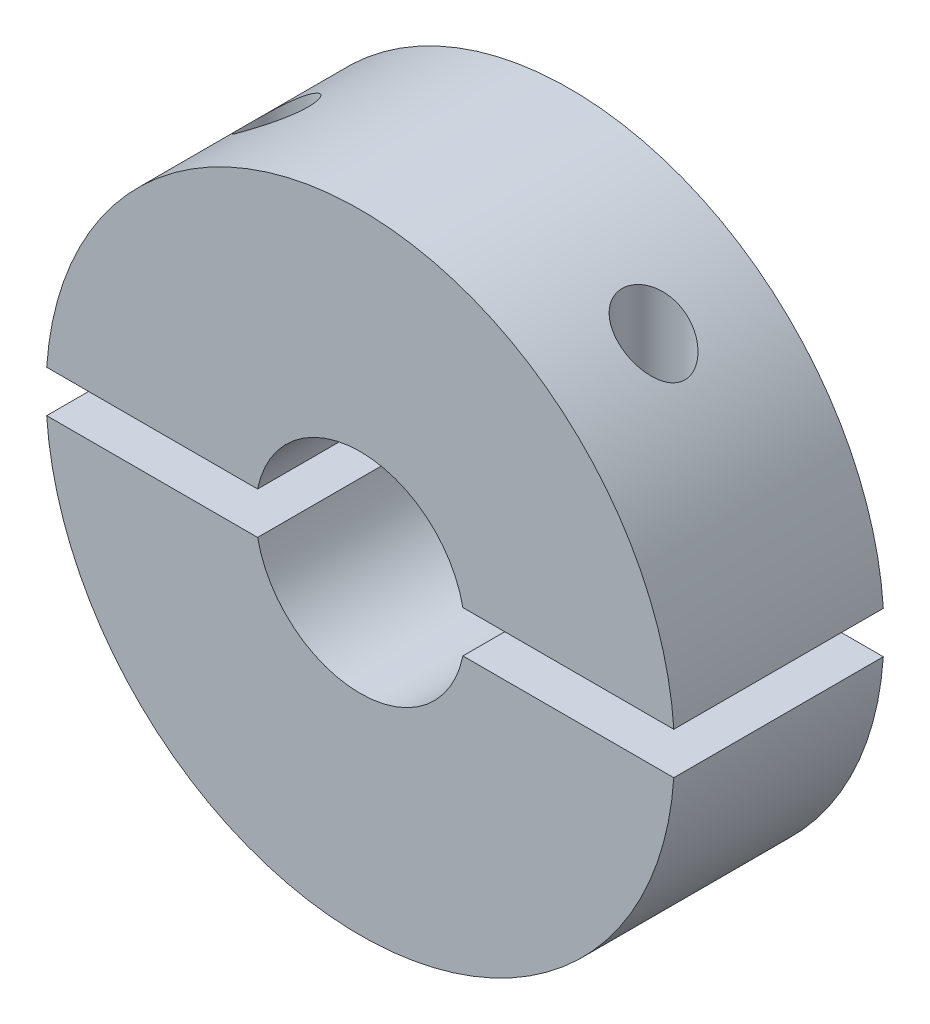
ISO-10303-21;
HEADER;
FILE_DESCRIPTION(('STEP AP214'),'2;1');
FILE_NAME('part.step','',(''),(''),'','','');
FILE_SCHEMA(('AUTOMOTIVE_DESIGN { 1 0 10303 214 1 1 1 1 }'));
ENDSEC;
DATA;
#1=APPLICATION_CONTEXT('core data for automotive mechanical design processes');
#2=APPLICATION_PROTOCOL_DEFINITION('international standard','automotive_design',2000,#1);
#3=PRODUCT_CONTEXT('',#1,'mechanical');
#4=PRODUCT('Part','Part','',(#3));
#5=PRODUCT_RELATED_PRODUCT_CATEGORY('part','',(#4));
#6=PRODUCT_DEFINITION_FORMATION('','',#4);
#7=PRODUCT_DEFINITION_CONTEXT('part definition',#1,'design');
#8=PRODUCT_DEFINITION('design','',#6,#7);
#9=PRODUCT_DEFINITION_SHAPE('','',#8);
#10=(LENGTH_UNIT() NAMED_UNIT(*) SI_UNIT(.MILLI.,.METRE.));
#11=(NAMED_UNIT(*) PLANE_ANGLE_UNIT() SI_UNIT($,.RADIAN.));
#12=(NAMED_UNIT(*) SI_UNIT($,.STERADIAN.) SOLID_ANGLE_UNIT());
#13=UNCERTAINTY_MEASURE_WITH_UNIT(LENGTH_MEASURE(1.E-05),#10,'distance_accuracy_value','');
#14=(GEOMETRIC_REPRESENTATION_CONTEXT(3) GLOBAL_UNCERTAINTY_ASSIGNED_CONTEXT((#13)) GLOBAL_UNIT_ASSIGNED_CONTEXT((#10,
#11,#12)) REPRESENTATION_CONTEXT('',''));
#15=CARTESIAN_POINT('',(0.,0.,0.));
#16=DIRECTION('',(0.,0.,1.));
#17=DIRECTION('',(1.,0.,0.));
#18=AXIS2_PLACEMENT_3D('',#15,#16,#17);
#19=CARTESIAN_POINT('',(0.,0.,5.));
#20=DIRECTION('',(0.,0.,1.));
#21=DIRECTION('',(1.,0.,0.));
#22=AXIS2_PLACEMENT_3D('',#19,#20,#21);
#23=PLANE('',#22);
#24=DIRECTION('',(1.,0.,0.));
#25=VECTOR('',#24,1.);
#26=CARTESIAN_POINT('',(-22.785877276911,-0.999999999999994,5.));
#27=LINE('',#26,#25);
#28=CARTESIAN_POINT('',(-14.9666295470958,-0.999999999999995,5.));
#29=VERTEX_POINT('',#28);
#30=CARTESIAN_POINT('',(-4.89897948556636,-0.999999999999997,5.));
#31=VERTEX_POINT('',#30);
#32=EDGE_CURVE('E53',#29,#31,#27,.T.);
#33=ORIENTED_EDGE('',*,*,#32,.F.);
#34=CARTESIAN_POINT('',(0.,0.,5.));
#35=DIRECTION('',(0.,0.,1.));
#36=DIRECTION('',(1.,0.,0.));
#37=AXIS2_PLACEMENT_3D('',#34,#35,#36);
#38=CIRCLE('',#37,15.);
#39=CARTESIAN_POINT('',(14.9666295470958,-0.999999999999999,5.));
#40=VERTEX_POINT('',#39);
#41=EDGE_CURVE('E107',#29,#40,#38,.T.);
#42=ORIENTED_EDGE('',*,*,#41,.T.);
#43=CARTESIAN_POINT('',(4.89897948556636,-0.999999999999998,5.));
#44=VERTEX_POINT('',#43);
#45=EDGE_CURVE('E103',#44,#40,#27,.T.);
#46=ORIENTED_EDGE('',*,*,#45,.F.);
#47=CARTESIAN_POINT('',(0.,0.,5.));
#48=DIRECTION('',(0.,0.,1.));
#49=DIRECTION('',(1.,0.,0.));
#50=AXIS2_PLACEMENT_3D('',#47,#48,#49);
#51=CIRCLE('',#50,5.);
#52=EDGE_CURVE('E102',#31,#44,#51,.T.);
#53=ORIENTED_EDGE('',*,*,#52,.F.);
#54=EDGE_LOOP('',(#33,#42,#46,#53));
#55=FACE_BOUND('',#54,.T.);
#56=ADVANCED_FACE('F45',(#55),#23,.T.);
#57=CARTESIAN_POINT('',(0.,0.,-5.));
#58=DIRECTION('',(0.,0.,1.));
#59=DIRECTION('',(1.,0.,0.));
#60=AXIS2_PLACEMENT_3D('',#57,#58,#59);
#61=PLANE('',#60);
#62=CARTESIAN_POINT('',(0.,0.,-5.));
#63=DIRECTION('',(0.,0.,1.));
#64=DIRECTION('',(1.,0.,0.));
#65=AXIS2_PLACEMENT_3D('',#62,#63,#64);
#66=CIRCLE('',#65,15.);
#67=CARTESIAN_POINT('',(-14.9666295470958,-0.999999999999995,-5.));
#68=VERTEX_POINT('',#67);
#69=CARTESIAN_POINT('',(14.9666295470958,-0.999999999999999,-5.));
#70=VERTEX_POINT('',#69);
#71=EDGE_CURVE('E161',#68,#70,#66,.T.);
#72=ORIENTED_EDGE('',*,*,#71,.F.);
#73=DIRECTION('',(1.,0.,0.));
#74=VECTOR('',#73,1.);
#75=CARTESIAN_POINT('',(0.,-0.999999999999997,-5.));
#76=LINE('',#75,#74);
#77=CARTESIAN_POINT('',(-4.89897948556636,-0.999999999999997,-5.));
#78=VERTEX_POINT('',#77);
#79=EDGE_CURVE('E66',#68,#78,#76,.T.);
#80=ORIENTED_EDGE('',*,*,#79,.T.);
#81=CARTESIAN_POINT('',(0.,0.,-5.));
#82=DIRECTION('',(0.,0.,1.));
#83=DIRECTION('',(1.,0.,0.));
#84=AXIS2_PLACEMENT_3D('',#81,#82,#83);
#85=CIRCLE('',#84,5.);
#86=CARTESIAN_POINT('',(4.89897948556636,-0.999999999999998,-5.));
#87=VERTEX_POINT('',#86);
#88=EDGE_CURVE('E94',#78,#87,#85,.T.);
#89=ORIENTED_EDGE('',*,*,#88,.T.);
#90=EDGE_CURVE('E86',#87,#70,#76,.T.);
#91=ORIENTED_EDGE('',*,*,#90,.T.);
#92=EDGE_LOOP('',(#72,#80,#89,#91));
#93=FACE_BOUND('',#92,.T.);
#94=ADVANCED_FACE('F105',(#93),#61,.F.);
#95=CARTESIAN_POINT('',(0.,0.,5.));
#96=DIRECTION('',(0.,0.,-1.));
#97=DIRECTION('',(-1.,0.,0.));
#98=AXIS2_PLACEMENT_3D('',#95,#96,#97);
#99=CYLINDRICAL_SURFACE('',#98,15.);
#100=CARTESIAN_POINT('',(9.,-12.,1.5));
#101=CARTESIAN_POINT('',(9.10146795644678,-11.9238956811104,1.49999873816091));
#102=CARTESIAN_POINT('',(9.20210069904862,-11.84639226454,1.48970356844833));
#103=CARTESIAN_POINT('',(9.39919866289182,-11.6906352165527,1.44941864026181));
#104=CARTESIAN_POINT('',(9.49564709678427,-11.6123798707279,1.41935619325879));
#105=CARTESIAN_POINT('',(9.6868399702551,-11.4534439738169,1.33777177644788));
#106=CARTESIAN_POINT('',(9.78121453182036,-11.372858975388,1.28518374912011));
#107=CARTESIAN_POINT('',(9.95926440954907,-11.217260360693,1.15832463241532));
#108=CARTESIAN_POINT('',(10.0429687938645,-11.1422318517812,1.08411434417772));
#109=CARTESIAN_POINT('',(10.1667366631008,-11.0291287944027,0.945428475299934));
#110=CARTESIAN_POINT('',(10.211398759155,-10.9877431519344,0.887728109479105));
#111=CARTESIAN_POINT('',(10.293233867023,-10.9111162002835,0.76357908787927));
#112=CARTESIAN_POINT('',(10.3304188141114,-10.8758651112231,0.697144658649385));
#113=CARTESIAN_POINT('',(10.3891288414332,-10.8197660344397,0.56945577930004));
#114=CARTESIAN_POINT('',(10.4122858820101,-10.7974547102503,0.509602049634197));
#115=CARTESIAN_POINT('',(10.451103564058,-10.7598869815412,0.385384483253045));
#116=CARTESIAN_POINT('',(10.4667694008358,-10.7446256879278,0.321023807815994));
#117=CARTESIAN_POINT('',(10.4895726618851,-10.7223658918368,0.188919062757579));
#118=CARTESIAN_POINT('',(10.4966525706539,-10.7154231172159,0.121155308298175));
#119=CARTESIAN_POINT('',(10.5014692172716,-10.7107030230054,-0.0150150764991994));
#120=CARTESIAN_POINT('',(10.4992095574067,-10.712922169648,-0.0834214488230391));
#121=CARTESIAN_POINT('',(10.4863018623363,-10.7255552482874,-0.211149282476349));
#122=CARTESIAN_POINT('',(10.4765767844012,-10.7350673902693,-0.270659938604422));
#123=CARTESIAN_POINT('',(10.4504989151758,-10.7604554613395,-0.386780440812935));
#124=CARTESIAN_POINT('',(10.4341435528538,-10.7763338590509,-0.443389152000269));
#125=CARTESIAN_POINT('',(10.3896855228589,-10.8192260185909,-0.569680827642558));
#126=CARTESIAN_POINT('',(10.3595131233302,-10.8481656826663,-0.637979210731937));
#127=CARTESIAN_POINT('',(10.2912153709351,-10.9129788799567,-0.766883250423398));
#128=CARTESIAN_POINT('',(10.2530745699735,-10.9488658716764,-0.827473591070292));
#129=CARTESIAN_POINT('',(10.1565971870857,-11.0385314781876,-0.959713494783675));
#130=CARTESIAN_POINT('',(10.0957839514264,-11.0942665356601,-1.02822122050056));
#131=CARTESIAN_POINT('',(9.96583829296361,-11.2111434130368,-1.15116258002726));
#132=CARTESIAN_POINT('',(9.89669797501151,-11.2722903493071,-1.20558270057551));
#133=CARTESIAN_POINT('',(9.75039409286854,-11.3990964203828,-1.3018246301562));
#134=CARTESIAN_POINT('',(9.67308034619307,-11.4648277612652,-1.34332089982197));
#135=CARTESIAN_POINT('',(9.51346047516274,-11.5976233513229,-1.41205945150811));
#136=CARTESIAN_POINT('',(9.4311533984733,-11.6646878531104,-1.43929900487105));
#137=CARTESIAN_POINT('',(9.24584964056327,-11.8123226374506,-1.48336675253591));
#138=CARTESIAN_POINT('',(9.14204627524058,-11.8928693011068,-1.49695637483546));
#139=CARTESIAN_POINT('',(8.93192855145563,-12.051471031565,-1.5021314420489));
#140=CARTESIAN_POINT('',(8.82561434386844,-12.1295262474172,-1.49371820578515));
#141=CARTESIAN_POINT('',(8.63146811269034,-12.2682343404153,-1.45680008530326));
#142=CARTESIAN_POINT('',(8.54349009862345,-12.329628929539,-1.43185195685866));
#143=CARTESIAN_POINT('',(8.37084073018998,-12.4474857677244,-1.36481078738381));
#144=CARTESIAN_POINT('',(8.28616517882108,-12.5039543980112,-1.32274033997154));
#145=CARTESIAN_POINT('',(8.13646028251312,-12.6017740906232,-1.22914596137307));
#146=CARTESIAN_POINT('',(8.07045392024642,-12.6440988886487,-1.18020752875034));
#147=CARTESIAN_POINT('',(7.94552376734654,-12.7229754147152,-1.07004922710386));
#148=CARTESIAN_POINT('',(7.88659878231531,-12.7595281166487,-1.0088314338712));
#149=CARTESIAN_POINT('',(7.77819805721522,-12.825900164861,-0.874470587831472));
#150=CARTESIAN_POINT('',(7.72879014705316,-12.8556714343487,-0.801248354624678));
#151=CARTESIAN_POINT('',(7.64282910416179,-12.9069627799333,-0.644993212771169));
#152=CARTESIAN_POINT('',(7.60626595415299,-12.9284892870842,-0.561968017010753));
#153=CARTESIAN_POINT('',(7.55211552310248,-12.9601856069291,-0.399975272645831));
#154=CARTESIAN_POINT('',(7.5327107560382,-12.9714488642069,-0.321826742673754));
#155=CARTESIAN_POINT('',(7.50668236960232,-12.9865297637773,-0.162742086259014));
#156=CARTESIAN_POINT('',(7.50005097425871,-12.9903519359518,-0.0818076863221105));
#157=CARTESIAN_POINT('',(7.49995382159244,-12.9904074347428,0.0732180350255885));
#158=CARTESIAN_POINT('',(7.50542599185105,-12.9872529555397,0.147311443631014));
#159=CARTESIAN_POINT('',(7.52711426252439,-12.9746948435799,0.293350171173787));
#160=CARTESIAN_POINT('',(7.54332888458309,-12.9652920707011,0.365295784263154));
#161=CARTESIAN_POINT('',(7.58560569747335,-12.9406018241993,0.504752181525315));
#162=CARTESIAN_POINT('',(7.61161972547055,-12.9253431249261,0.572282790015573));
#163=CARTESIAN_POINT('',(7.67234104914302,-12.8893918736371,0.701738767012449));
#164=CARTESIAN_POINT('',(7.70705018514626,-12.8686981712527,0.763662945130598));
#165=CARTESIAN_POINT('',(7.78626546919482,-12.8209335389089,0.884534235512223));
#166=CARTESIAN_POINT('',(7.83125899480485,-12.7935374600719,0.943031976978281));
#167=CARTESIAN_POINT('',(7.92780298948557,-12.7339372559856,1.05150977840286));
#168=CARTESIAN_POINT('',(7.97935542229609,-12.7017316902698,1.10148727686716));
#169=CARTESIAN_POINT('',(8.09386344380788,-12.6291129809418,1.19798794001941));
#170=CARTESIAN_POINT('',(8.15744483730025,-12.5881785830179,1.24337345893958));
#171=CARTESIAN_POINT('',(8.2887218524681,-12.5021303276337,1.32286933175008));
#172=CARTESIAN_POINT('',(8.35642134256542,-12.4570125188739,1.35696888408621));
#173=CARTESIAN_POINT('',(8.50519872483841,-12.356007121649,1.4186813588195));
#174=CARTESIAN_POINT('',(8.58668203930169,-12.2995522773014,1.44437924677191));
#175=CARTESIAN_POINT('',(8.75050753613556,-12.1835410252351,1.48148513066667));
#176=CARTESIAN_POINT('',(8.83284850053694,-12.1239886347147,1.49291117702029));
#177=CARTESIAN_POINT('',(8.94321311977777,-12.0424337947041,1.49919651314814));
#178=CARTESIAN_POINT('',(8.97163918464593,-12.0212715482923,1.50000035269051));
#179=CARTESIAN_POINT('',(9.,-12.,1.5));
#180=B_SPLINE_CURVE_WITH_KNOTS('',3,(#100,#101,#102,#103,#104,#105,#106,#107,#108,#109,#110,
#111,#112,#113,#114,#115,#116,#117,#118,#119,#120,#121,#122,#123,#124,#125,#126,#127,#128,#129,
#130,#131,#132,#133,#134,#135,#136,#137,#138,#139,#140,#141,#142,#143,#144,#145,#146,#147,#148,
#149,#150,#151,#152,#153,#154,#155,#156,#157,#158,#159,#160,#161,#162,#163,#164,#165,#166,#167,
#168,#169,#170,#171,#172,#173,#174,#175,#176,#177,#178,#179),.UNSPECIFIED.,.T.,.F.,(4,2,2,2,2,2,
2,2,2,2,2,2,2,2,2,2,2,2,2,2,2,2,2,2,2,2,2,2,2,2,2,2,2,2,2,2,2,2,2,4),(0.,0.380426775988975,
0.762260345537144,1.16460616773911,1.5658313483118,1.81668528703148,2.06713556887812,
2.27016750475679,2.47305842878326,2.67730110349198,2.88146500883377,3.06379418618069,
3.24619413322336,3.48511737497512,3.72450818101545,4.04447400828753,4.36474562869247,
4.69253149115311,5.0203800671122,5.41482085644089,5.80923800404996,6.13835933166796,
6.46704777071098,6.74320434465106,7.01931427438906,7.29732464568308,7.57511772040093,
7.81770904412415,8.06015264019091,8.28217162147739,8.50416005527397,8.72507138548947,
8.94602951136198,9.18123399466207,9.41650906474434,9.68006964210928,9.94388174303793,
10.2499678147866,10.5556663687562,10.6619976079709),.UNSPECIFIED.);
#181=CARTESIAN_POINT('',(9.,-12.,1.5));
#182=VERTEX_POINT('',#181);
#183=EDGE_CURVE('E120',#182,#182,#180,.T.);
#184=ORIENTED_EDGE('',*,*,#183,.T.);
#185=EDGE_LOOP('',(#184));
#186=FACE_BOUND('',#185,.T.);
#187=CARTESIAN_POINT('',(-9.,-12.,1.5));
#188=CARTESIAN_POINT('',(-8.89806281996808,-12.076448740087,1.49999880049578));
#189=CARTESIAN_POINT('',(-8.79502047466653,-12.1516844505161,1.48961564489732));
#190=CARTESIAN_POINT('',(-8.58997368180819,-12.2974868682519,1.44666904888837));
#191=CARTESIAN_POINT('',(-8.48797037829818,-12.3680488192858,1.41408338324722));
#192=CARTESIAN_POINT('',(-8.3124723831113,-12.4864450330786,1.33577009319488));
#193=CARTESIAN_POINT('',(-8.23784183771065,-12.5357606139173,1.29482710220169));
#194=CARTESIAN_POINT('',(-8.09438638300581,-12.6288637898429,1.19887242138175));
#195=CARTESIAN_POINT('',(-8.02555652142559,-12.6726561165466,1.14387289734403));
#196=CARTESIAN_POINT('',(-7.89614861197852,-12.7536945103278,1.01961754928185));
#197=CARTESIAN_POINT('',(-7.83564150600628,-12.7908849999825,0.950250448376171));
#198=CARTESIAN_POINT('',(-7.72702527466581,-12.8567933109377,0.798865563323626));
#199=CARTESIAN_POINT('',(-7.67890615423112,-12.8855179655017,0.716858063856762));
#200=CARTESIAN_POINT('',(-7.60402274111278,-12.9298286903932,0.555030389672953));
#201=CARTESIAN_POINT('',(-7.57521498866034,-12.9466891674304,0.476503246106244));
#202=CARTESIAN_POINT('',(-7.53095651989616,-12.9724848624903,0.314544597899211));
#203=CARTESIAN_POINT('',(-7.51549457097868,-12.9814267454282,0.231117280827801));
#204=CARTESIAN_POINT('',(-7.49981815488604,-12.9904885949658,0.0717474976417792));
#205=CARTESIAN_POINT('',(-7.49810713213753,-12.9914744918195,-0.00400291015569512));
#206=CARTESIAN_POINT('',(-7.50609275911616,-12.9868623612687,-0.154684554045194));
#207=CARTESIAN_POINT('',(-7.51578630955003,-12.9812661226178,-0.229616007111137));
#208=CARTESIAN_POINT('',(-7.54562135449501,-12.9639453794313,-0.374271154970538));
#209=CARTESIAN_POINT('',(-7.56544610153074,-12.9524065858986,-0.444083276478104));
#210=CARTESIAN_POINT('',(-7.61443000349927,-12.9236704244803,-0.579098631855485));
#211=CARTESIAN_POINT('',(-7.64359017369793,-12.9064724411289,-0.644301363493084));
#212=CARTESIAN_POINT('',(-7.7114808784046,-12.8660283158982,-0.771453058961722));
#213=CARTESIAN_POINT('',(-7.7505767661334,-12.8425488898216,-0.833131710367352));
#214=CARTESIAN_POINT('',(-7.83602343428975,-12.7905916550789,-0.948861951687202));
#215=CARTESIAN_POINT('',(-7.88237665918428,-12.7621121618616,-1.00291096002465));
#216=CARTESIAN_POINT('',(-7.98588384512631,-12.6976274873303,-1.1079514032576));
#217=CARTESIAN_POINT('',(-8.04366009719138,-12.6611471523261,-1.15803561507679));
#218=CARTESIAN_POINT('',(-8.16412988118218,-12.5838037096778,-1.24778716451905));
#219=CARTESIAN_POINT('',(-8.2268258452563,-12.5429384305425,-1.28744930713212));
#220=CARTESIAN_POINT('',(-8.3650268803983,-12.4512719294555,-1.36155800759427));
#221=CARTESIAN_POINT('',(-8.44104519364252,-12.3998988059359,-1.39433708664913));
#222=CARTESIAN_POINT('',(-8.59511227216478,-12.2936092239748,-1.44661479250871));
#223=CARTESIAN_POINT('',(-8.67316208554814,-12.2386909139493,-1.46610641708049));
#224=CARTESIAN_POINT('',(-8.842860674992,-12.1167849865227,-1.49462775504781));
#225=CARTESIAN_POINT('',(-8.9345686339259,-12.0493311963845,-1.50131960108158));
#226=CARTESIAN_POINT('',(-9.11626990040248,-11.9124556373958,-1.49824961189585));
#227=CARTESIAN_POINT('',(-9.20626155920204,-11.8430321213239,-1.48847268921911));
#228=CARTESIAN_POINT('',(-9.39522157060276,-11.6938553492121,-1.45063960374974));
#229=CARTESIAN_POINT('',(-9.49366047448141,-11.6140292160274,-1.42019474109116));
#230=CARTESIAN_POINT('',(-9.6835436534558,-11.4561862543316,-1.33918751783251));
#231=CARTESIAN_POINT('',(-9.77498886809361,-11.3781691837732,-1.28862786516159));
#232=CARTESIAN_POINT('',(-9.93014096402266,-11.2428034799545,-1.17977432351013));
#233=CARTESIAN_POINT('',(-9.9956731793011,-11.1845173238356,-1.12524264733252));
#234=CARTESIAN_POINT('',(-10.1186439395609,-11.0733856992446,-1.00305789178407));
#235=CARTESIAN_POINT('',(-10.176095517371,-11.0205315078112,-0.935426369250615));
#236=CARTESIAN_POINT('',(-10.2670971243444,-10.9357017939449,-0.805645756940776));
#237=CARTESIAN_POINT('',(-10.3030214274704,-10.9018218820696,-0.746412857431793));
#238=CARTESIAN_POINT('',(-10.367311958345,-10.8407013782678,-0.620817793900217));
#239=CARTESIAN_POINT('',(-10.3956883226137,-10.8134518862425,-0.554465360959545));
#240=CARTESIAN_POINT('',(-10.4391436991951,-10.7714919869694,-0.427307731357487));
#241=CARTESIAN_POINT('',(-10.4556545963895,-10.7554451604318,-0.367438116017301));
#242=CARTESIAN_POINT('',(-10.4812333489038,-10.7305205656939,-0.244680507889577));
#243=CARTESIAN_POINT('',(-10.4903064511231,-10.7216377438078,-0.181794676060509));
#244=CARTESIAN_POINT('',(-10.500371508161,-10.7117809951452,-0.0545215950960934));
#245=CARTESIAN_POINT('',(-10.5013346624393,-10.7108352550553,0.00987019130892504));
#246=CARTESIAN_POINT('',(-10.4950260187971,-10.7170166704839,0.137854784131019));
#247=CARTESIAN_POINT('',(-10.4877530261586,-10.7241449972094,0.201447473279652));
#248=CARTESIAN_POINT('',(-10.4661153943682,-10.7452611372791,0.322643863653296));
#249=CARTESIAN_POINT('',(-10.4521433802312,-10.7588689211578,0.380386685894734));
#250=CARTESIAN_POINT('',(-10.4181187482474,-10.7918192044622,0.492307601303549));
#251=CARTESIAN_POINT('',(-10.3980634742431,-10.8111642088705,0.546484124702927));
#252=CARTESIAN_POINT('',(-10.3433901774912,-10.8635274610573,0.672113352520977));
#253=CARTESIAN_POINT('',(-10.3061784930597,-10.8988931630159,0.74146103180502));
#254=CARTESIAN_POINT('',(-10.2236487599753,-10.9763483902644,0.870982508813744));
#255=CARTESIAN_POINT('',(-10.1783134774375,-11.0184521894512,0.931136289294727));
#256=CARTESIAN_POINT('',(-10.0651608577386,-11.1220583466942,1.06070337662822));
#257=CARTESIAN_POINT('',(-9.99488395987179,-11.1853518239847,1.12653059473887));
#258=CARTESIAN_POINT('',(-9.84604810908826,-11.3165906417953,1.24221784094964));
#259=CARTESIAN_POINT('',(-9.76747812768687,-11.3845421335723,1.29205624167266));
#260=CARTESIAN_POINT('',(-9.60248426656069,-11.5240711375814,1.37687735178418));
#261=CARTESIAN_POINT('',(-9.51593155153624,-11.5956945788252,1.41153146492354));
#262=CARTESIAN_POINT('',(-9.33838809366153,-11.7391427023625,1.46425330583851));
#263=CARTESIAN_POINT('',(-9.24740879833734,-11.8109664554613,1.482361647318));
#264=CARTESIAN_POINT('',(-9.10377740508036,-11.9216391645438,1.49729623063587));
#265=CARTESIAN_POINT('',(-9.05203267662838,-11.9609776082647,1.50000061227332));
#266=CARTESIAN_POINT('',(-9.,-12.,1.5));
#267=B_SPLINE_CURVE_WITH_KNOTS('',3,(#187,#188,#189,#190,#191,#192,#193,#194,#195,#196,#197,
#198,#199,#200,#201,#202,#203,#204,#205,#206,#207,#208,#209,#210,#211,#212,#213,#214,#215,#216,
#217,#218,#219,#220,#221,#222,#223,#224,#225,#226,#227,#228,#229,#230,#231,#232,#233,#234,#235,
#236,#237,#238,#239,#240,#241,#242,#243,#244,#245,#246,#247,#248,#249,#250,#251,#252,#253,#254,
#255,#256,#257,#258,#259,#260,#261,#262,#263,#264,#265,#266),.UNSPECIFIED.,.T.,.F.,(4,2,2,2,2,2,
2,2,2,2,2,2,2,2,2,2,2,2,2,2,2,2,2,2,2,2,2,2,2,2,2,2,2,2,2,2,2,2,2,4),(0.,0.382051043239442,
0.764485091447556,1.05844079384557,1.35214293702742,1.64821109085855,1.94403961240045,
2.19856752383969,2.45288100028147,2.67908202196769,2.90522158572917,3.12468803540993,
3.34417836108713,3.57334855967856,3.80259611570153,4.05575973479162,4.30904930807784,
4.60022480651068,4.89155363045798,5.23234073421313,5.57344021151565,5.96276004588067,
6.35202748626231,6.66078726566625,6.96904320793103,7.19958750342702,7.42982060768037,
7.62144631960994,7.81293673496678,8.00510689717663,8.1973049387506,8.37940604111716,
8.56158676973458,8.81900318208811,9.07697230156779,9.42083775466838,9.76516639740271,
10.1166171108543,10.4672028079109,10.6622164269083),.UNSPECIFIED.);
#268=CARTESIAN_POINT('',(-9.,-12.,1.5));
#269=VERTEX_POINT('',#268);
#270=EDGE_CURVE('E112',#269,#269,#267,.T.);
#271=ORIENTED_EDGE('',*,*,#270,.T.);
#272=EDGE_LOOP('',(#271));
#273=FACE_BOUND('',#272,.T.);
#274=ORIENTED_EDGE('',*,*,#41,.F.);
#275=DIRECTION('',(0.,0.,-1.));
#276=VECTOR('',#275,1.);
#277=CARTESIAN_POINT('',(-14.9666295470958,-0.999999999999995,5.));
#278=LINE('',#277,#276);
#279=EDGE_CURVE('E61',#29,#68,#278,.T.);
#280=ORIENTED_EDGE('',*,*,#279,.T.);
#281=ORIENTED_EDGE('',*,*,#71,.T.);
#282=DIRECTION('',(0.,0.,-1.));
#283=VECTOR('',#282,1.);
#284=CARTESIAN_POINT('',(14.9666295470958,-0.999999999999999,5.));
#285=LINE('',#284,#283);
#286=EDGE_CURVE('E89',#70,#40,#285,.F.);
#287=ORIENTED_EDGE('',*,*,#286,.T.);
#288=EDGE_LOOP('',(#274,#280,#281,#287));
#289=FACE_BOUND('',#288,.T.);
#290=ADVANCED_FACE('F131',(#186,#273,#289),#99,.T.);
#291=CARTESIAN_POINT('',(0.,0.,5.));
#292=DIRECTION('',(0.,0.,-1.));
#293=DIRECTION('',(-1.,0.,0.));
#294=AXIS2_PLACEMENT_3D('',#291,#292,#293);
#295=CYLINDRICAL_SURFACE('',#294,5.);
#296=DIRECTION('',(0.,0.,-1.));
#297=VECTOR('',#296,1.);
#298=CARTESIAN_POINT('',(-4.89897948556636,-0.999999999999997,5.));
#299=LINE('',#298,#297);
#300=EDGE_CURVE('E12',#31,#78,#299,.T.);
#301=ORIENTED_EDGE('',*,*,#300,.F.);
#302=ORIENTED_EDGE('',*,*,#52,.T.);
#303=DIRECTION('',(0.,0.,-1.));
#304=VECTOR('',#303,1.);
#305=CARTESIAN_POINT('',(4.89897948556636,-0.999999999999998,5.));
#306=LINE('',#305,#304);
#307=EDGE_CURVE('E83',#87,#44,#306,.F.);
#308=ORIENTED_EDGE('',*,*,#307,.F.);
#309=ORIENTED_EDGE('',*,*,#88,.F.);
#310=EDGE_LOOP('',(#301,#302,#308,#309));
#311=FACE_BOUND('',#310,.T.);
#312=ADVANCED_FACE('F100',(#311),#295,.F.);
#313=CARTESIAN_POINT('',(-22.785877276911,-0.999999999999994,-28.));
#314=DIRECTION('',(0.,-1.,0.));
#315=DIRECTION('',(1.,0.,0.));
#316=AXIS2_PLACEMENT_3D('',#313,#314,#315);
#317=PLANE('',#316);
#318=CARTESIAN_POINT('',(9.,-1.,0.));
#319=DIRECTION('',(0.,-1.,0.));
#320=DIRECTION('',(1.,0.,0.));
#321=AXIS2_PLACEMENT_3D('',#318,#319,#320);
#322=CIRCLE('',#321,1.5);
#323=CARTESIAN_POINT('',(10.5,-1.,0.));
#324=VERTEX_POINT('',#323);
#325=EDGE_CURVE('E48',#324,#324,#322,.T.);
#326=ORIENTED_EDGE('',*,*,#325,.T.);
#327=EDGE_LOOP('',(#326));
#328=FACE_BOUND('',#327,.T.);
#329=ORIENTED_EDGE('',*,*,#90,.F.);
#330=ORIENTED_EDGE('',*,*,#307,.T.);
#331=ORIENTED_EDGE('',*,*,#45,.T.);
#332=ORIENTED_EDGE('',*,*,#286,.F.);
#333=EDGE_LOOP('',(#329,#330,#331,#332));
#334=FACE_BOUND('',#333,.T.);
#335=ADVANCED_FACE('F87',(#328,#334),#317,.F.);
#336=CARTESIAN_POINT('',(-9.,-0.999999999999994,0.));
#337=DIRECTION('',(0.,-1.,0.));
#338=DIRECTION('',(1.,0.,0.));
#339=AXIS2_PLACEMENT_3D('',#336,#337,#338);
#340=CIRCLE('',#339,1.5);
#341=CARTESIAN_POINT('',(-7.5,-0.999999999999994,0.));
#342=VERTEX_POINT('',#341);
#343=EDGE_CURVE('E110',#342,#342,#340,.T.);
#344=ORIENTED_EDGE('',*,*,#343,.T.);
#345=EDGE_LOOP('',(#344));
#346=FACE_BOUND('',#345,.T.);
#347=ORIENTED_EDGE('',*,*,#32,.T.);
#348=ORIENTED_EDGE('',*,*,#300,.T.);
#349=ORIENTED_EDGE('',*,*,#79,.F.);
#350=ORIENTED_EDGE('',*,*,#279,.F.);
#351=EDGE_LOOP('',(#347,#348,#349,#350));
#352=FACE_BOUND('',#351,.T.);
#353=ADVANCED_FACE('F139',(#346,#352),#317,.F.);
#354=CARTESIAN_POINT('',(-9.,-41.5,0.));
#355=DIRECTION('',(0.,1.,0.));
#356=DIRECTION('',(0.,0.,1.));
#357=AXIS2_PLACEMENT_3D('',#354,#355,#356);
#358=CYLINDRICAL_SURFACE('',#357,1.5);
#359=ORIENTED_EDGE('',*,*,#343,.F.);
#360=EDGE_LOOP('',(#359));
#361=FACE_BOUND('',#360,.T.);
#362=ORIENTED_EDGE('',*,*,#270,.F.);
#363=EDGE_LOOP('',(#362));
#364=FACE_BOUND('',#363,.T.);
#365=ADVANCED_FACE('F134',(#361,#364),#358,.F.);
#366=CARTESIAN_POINT('',(9.,-41.5,0.));
#367=DIRECTION('',(0.,1.,0.));
#368=DIRECTION('',(0.,0.,1.));
#369=AXIS2_PLACEMENT_3D('',#366,#367,#368);
#370=CYLINDRICAL_SURFACE('',#369,1.5);
#371=ORIENTED_EDGE('',*,*,#325,.F.);
#372=EDGE_LOOP('',(#371));
#373=FACE_BOUND('',#372,.T.);
#374=ORIENTED_EDGE('',*,*,#183,.F.);
#375=EDGE_LOOP('',(#374));
#376=FACE_BOUND('',#375,.T.);
#377=ADVANCED_FACE('F138',(#373,#376),#370,.F.);
#378=CLOSED_SHELL('',(#56,#94,#290,#312,#335,#353,#365,#377));
#379=MANIFOLD_SOLID_BREP('B2',#378);
#380=CARTESIAN_POINT('',(0.,0.,5.));
#381=DIRECTION('',(0.,0.,-1.));
#382=DIRECTION('',(-1.,0.,0.));
#383=AXIS2_PLACEMENT_3D('',#380,#381,#382);
#384=CYLINDRICAL_SURFACE('',#383,5.);
#385=DIRECTION('',(0.,0.,-1.));
#386=VECTOR('',#385,1.);
#387=CARTESIAN_POINT('',(4.89897948556636,0.999999999999998,5.));
#388=LINE('',#387,#386);
#389=CARTESIAN_POINT('',(4.89897948556636,0.999999999999998,5.));
#390=VERTEX_POINT('',#389);
#391=CARTESIAN_POINT('',(4.89897948556636,0.999999999999998,-5.));
#392=VERTEX_POINT('',#391);
#393=EDGE_CURVE('E43',#390,#392,#388,.T.);
#394=ORIENTED_EDGE('',*,*,#393,.F.);
#395=CARTESIAN_POINT('',(0.,0.,5.));
#396=DIRECTION('',(0.,0.,1.));
#397=DIRECTION('',(1.,0.,0.));
#398=AXIS2_PLACEMENT_3D('',#395,#396,#397);
#399=CIRCLE('',#398,5.);
#400=CARTESIAN_POINT('',(-4.89897948556636,0.999999999999997,5.));
#401=VERTEX_POINT('',#400);
#402=EDGE_CURVE('E276',#390,#401,#399,.T.);
#403=ORIENTED_EDGE('',*,*,#402,.T.);
#404=DIRECTION('',(0.,0.,-1.));
#405=VECTOR('',#404,1.);
#406=CARTESIAN_POINT('',(-4.89897948556636,0.999999999999997,5.));
#407=LINE('',#406,#405);
#408=CARTESIAN_POINT('',(-4.89897948556636,0.999999999999997,-5.));
#409=VERTEX_POINT('',#408);
#410=EDGE_CURVE('E228',#409,#401,#407,.F.);
#411=ORIENTED_EDGE('',*,*,#410,.F.);
#412=CARTESIAN_POINT('',(0.,0.,-5.));
#413=DIRECTION('',(0.,0.,1.));
#414=DIRECTION('',(1.,0.,0.));
#415=AXIS2_PLACEMENT_3D('',#412,#413,#414);
#416=CIRCLE('',#415,5.);
#417=EDGE_CURVE('E267',#392,#409,#416,.T.);
#418=ORIENTED_EDGE('',*,*,#417,.F.);
#419=EDGE_LOOP('',(#394,#403,#411,#418));
#420=FACE_BOUND('',#419,.T.);
#421=ADVANCED_FACE('F218',(#420),#384,.F.);
#422=CARTESIAN_POINT('',(0.,0.,5.));
#423=DIRECTION('',(0.,0.,-1.));
#424=DIRECTION('',(-1.,0.,0.));
#425=AXIS2_PLACEMENT_3D('',#422,#423,#424);
#426=CYLINDRICAL_SURFACE('',#425,15.);
#427=CARTESIAN_POINT('',(9.,12.,1.5));
#428=CARTESIAN_POINT('',(8.89806281996808,12.076448740087,1.49999880049577));
#429=CARTESIAN_POINT('',(8.79502047466653,12.1516844505161,1.48961564489732));
#430=CARTESIAN_POINT('',(8.5899736818082,12.2974868682519,1.44666904888837));
#431=CARTESIAN_POINT('',(8.48797037829818,12.3680488192858,1.41408338324722));
#432=CARTESIAN_POINT('',(8.31247238311131,12.4864450330786,1.33577009319488));
#433=CARTESIAN_POINT('',(8.23784183771066,12.5357606139173,1.29482710220169));
#434=CARTESIAN_POINT('',(8.09438638300582,12.6288637898429,1.19887242138175));
#435=CARTESIAN_POINT('',(8.02555652142559,12.6726561165466,1.14387289734402));
#436=CARTESIAN_POINT('',(7.89614861197852,12.7536945103278,1.01961754928185));
#437=CARTESIAN_POINT('',(7.83564150600628,12.7908849999825,0.950250448376171));
#438=CARTESIAN_POINT('',(7.72702527466581,12.8567933109377,0.798865563323625));
#439=CARTESIAN_POINT('',(7.67890615423113,12.8855179655017,0.716858063856759));
#440=CARTESIAN_POINT('',(7.60402274111278,12.9298286903932,0.55503038967295));
#441=CARTESIAN_POINT('',(7.57521498866034,12.9466891674304,0.47650324610624));
#442=CARTESIAN_POINT('',(7.53095651989616,12.9724848624903,0.314544597899207));
#443=CARTESIAN_POINT('',(7.51549457097868,12.9814267454282,0.231117280827796));
#444=CARTESIAN_POINT('',(7.49981815488604,12.9904885949658,0.0717474976417726));
#445=CARTESIAN_POINT('',(7.49810713213753,12.9914744918195,-0.0040029101557024));
#446=CARTESIAN_POINT('',(7.50609275911616,12.9868623612687,-0.154684554045202));
#447=CARTESIAN_POINT('',(7.51578630955003,12.9812661226178,-0.229616007111146));
#448=CARTESIAN_POINT('',(7.54562135449501,12.9639453794313,-0.374271154970547));
#449=CARTESIAN_POINT('',(7.56544610153074,12.9524065858986,-0.444083276478114));
#450=CARTESIAN_POINT('',(7.61443000349927,12.9236704244803,-0.579098631855497));
#451=CARTESIAN_POINT('',(7.64359017369794,12.9064724411289,-0.644301363493095));
#452=CARTESIAN_POINT('',(7.7114808784046,12.8660283158982,-0.771453058961734));
#453=CARTESIAN_POINT('',(7.7505767661334,12.8425488898216,-0.833131710367365));
#454=CARTESIAN_POINT('',(7.83602343428976,12.7905916550789,-0.948861951687215));
#455=CARTESIAN_POINT('',(7.88237665918429,12.7621121618616,-1.00291096002466));
#456=CARTESIAN_POINT('',(7.98588384512632,12.6976274873302,-1.10795140325761));
#457=CARTESIAN_POINT('',(8.0436600971914,12.661147152326,-1.1580356150768));
#458=CARTESIAN_POINT('',(8.16412988118219,12.5838037096778,-1.24778716451907));
#459=CARTESIAN_POINT('',(8.22682584525631,12.5429384305425,-1.28744930713214));
#460=CARTESIAN_POINT('',(8.36502688039831,12.4512719294555,-1.36155800759429));
#461=CARTESIAN_POINT('',(8.44104519364254,12.3998988059359,-1.39433708664914));
#462=CARTESIAN_POINT('',(8.5951122721648,12.2936092239748,-1.44661479250872));
#463=CARTESIAN_POINT('',(8.67316208554816,12.2386909139493,-1.46610641708049));
#464=CARTESIAN_POINT('',(8.84286067499202,12.1167849865227,-1.49462775504781));
#465=CARTESIAN_POINT('',(8.93456863392592,12.0493311963845,-1.50131960108159));
#466=CARTESIAN_POINT('',(9.11626990040249,11.9124556373958,-1.49824961189585));
#467=CARTESIAN_POINT('',(9.20626155920207,11.8430321213239,-1.48847268921911));
#468=CARTESIAN_POINT('',(9.39522157060278,11.6938553492121,-1.45063960374974));
#469=CARTESIAN_POINT('',(9.49366047448143,11.6140292160274,-1.42019474109115));
#470=CARTESIAN_POINT('',(9.68354365345583,11.4561862543316,-1.3391875178325));
#471=CARTESIAN_POINT('',(9.77498886809364,11.3781691837732,-1.28862786516158));
#472=CARTESIAN_POINT('',(9.93014096402268,11.2428034799545,-1.17977432351012));
#473=CARTESIAN_POINT('',(9.99567317930112,11.1845173238356,-1.1252426473325));
#474=CARTESIAN_POINT('',(10.1186439395609,11.0733856992445,-1.00305789178406));
#475=CARTESIAN_POINT('',(10.176095517371,11.0205315078112,-0.935426369250599));
#476=CARTESIAN_POINT('',(10.2670971243444,10.9357017939449,-0.805645756940761));
#477=CARTESIAN_POINT('',(10.3030214274704,10.9018218820696,-0.74641285743178));
#478=CARTESIAN_POINT('',(10.367311958345,10.8407013782678,-0.620817793900205));
#479=CARTESIAN_POINT('',(10.3956883226137,10.8134518862425,-0.554465360959532));
#480=CARTESIAN_POINT('',(10.4391436991951,10.7714919869694,-0.427307731357476));
#481=CARTESIAN_POINT('',(10.4556545963895,10.7554451604318,-0.367438116017291));
#482=CARTESIAN_POINT('',(10.4812333489038,10.7305205656939,-0.244680507889568));
#483=CARTESIAN_POINT('',(10.4903064511231,10.7216377438078,-0.181794676060501));
#484=CARTESIAN_POINT('',(10.500371508161,10.7117809951452,-0.0545215950960867));
#485=CARTESIAN_POINT('',(10.5013346624393,10.7108352550553,0.00987019130893066));
#486=CARTESIAN_POINT('',(10.4950260187971,10.7170166704839,0.137854784131022));
#487=CARTESIAN_POINT('',(10.4877530261586,10.7241449972094,0.201447473279655));
#488=CARTESIAN_POINT('',(10.4661153943682,10.7452611372791,0.322643863653297));
#489=CARTESIAN_POINT('',(10.4521433802312,10.7588689211578,0.380386685894733));
#490=CARTESIAN_POINT('',(10.4181187482474,10.7918192044622,0.492307601303547));
#491=CARTESIAN_POINT('',(10.3980634742431,10.8111642088705,0.546484124702924));
#492=CARTESIAN_POINT('',(10.3433901774912,10.8635274610573,0.672113352520973));
#493=CARTESIAN_POINT('',(10.3061784930597,10.8988931630159,0.741461031805017));
#494=CARTESIAN_POINT('',(10.2236487599753,10.9763483902644,0.87098250881374));
#495=CARTESIAN_POINT('',(10.1783134774375,11.0184521894512,0.931136289294721));
#496=CARTESIAN_POINT('',(10.0651608577386,11.1220583466942,1.06070337662821));
#497=CARTESIAN_POINT('',(9.9948839598718,11.1853518239847,1.12653059473886));
#498=CARTESIAN_POINT('',(9.84604810908827,11.3165906417953,1.24221784094963));
#499=CARTESIAN_POINT('',(9.76747812768687,11.3845421335723,1.29205624167265));
#500=CARTESIAN_POINT('',(9.6024842665607,11.5240711375814,1.37687735178417));
#501=CARTESIAN_POINT('',(9.51593155153625,11.5956945788252,1.41153146492354));
#502=CARTESIAN_POINT('',(9.33838809366154,11.7391427023625,1.46425330583851));
#503=CARTESIAN_POINT('',(9.24740879833735,11.8109664554613,1.482361647318));
#504=CARTESIAN_POINT('',(9.10377740508036,11.9216391645438,1.49729623063587));
#505=CARTESIAN_POINT('',(9.05203267662838,11.9609776082647,1.50000061227331));
#506=CARTESIAN_POINT('',(9.,12.,1.5));
#507=B_SPLINE_CURVE_WITH_KNOTS('',3,(#427,#428,#429,#430,#431,#432,#433,#434,#435,#436,#437,
#438,#439,#440,#441,#442,#443,#444,#445,#446,#447,#448,#449,#450,#451,#452,#453,#454,#455,#456,
#457,#458,#459,#460,#461,#462,#463,#464,#465,#466,#467,#468,#469,#470,#471,#472,#473,#474,#475,
#476,#477,#478,#479,#480,#481,#482,#483,#484,#485,#486,#487,#488,#489,#490,#491,#492,#493,#494,
#495,#496,#497,#498,#499,#500,#501,#502,#503,#504,#505,#506),.UNSPECIFIED.,.T.,.F.,(4,2,2,2,2,2,
2,2,2,2,2,2,2,2,2,2,2,2,2,2,2,2,2,2,2,2,2,2,2,2,2,2,2,2,2,2,2,2,2,4),(0.,0.382051043239441,
0.764485091447555,1.05844079384557,1.35214293702742,1.64821109085855,1.94403961240046,
2.1985675238397,2.45288100028148,2.6790820219677,2.90522158572918,3.12468803540995,
3.34417836108715,3.57334855967858,3.80259611570155,4.05575973479164,4.30904930807787,
4.60022480651071,4.89155363045801,5.23234073421316,5.57344021151569,5.96276004588071,
6.35202748626235,6.66078726566628,6.96904320793106,7.19958750342704,7.42982060768039,
7.62144631960995,7.81293673496679,8.00510689717664,8.19730493875061,8.37940604111717,
8.56158676973458,8.81900318208811,9.07697230156778,9.42083775466838,9.7651663974027,
10.1166171108542,10.4672028079109,10.6622164269083),.UNSPECIFIED.);
#508=CARTESIAN_POINT('',(9.,12.,1.5));
#509=VERTEX_POINT('',#508);
#510=EDGE_CURVE('E289',#509,#509,#507,.T.);
#511=ORIENTED_EDGE('',*,*,#510,.T.);
#512=EDGE_LOOP('',(#511));
#513=FACE_BOUND('',#512,.T.);
#514=CARTESIAN_POINT('',(-9.,12.,1.5));
#515=CARTESIAN_POINT('',(-9.10146795644678,11.9238956811104,1.49999873816091));
#516=CARTESIAN_POINT('',(-9.20210069904862,11.84639226454,1.48970356844834));
#517=CARTESIAN_POINT('',(-9.39919866289183,11.6906352165527,1.44941864026181));
#518=CARTESIAN_POINT('',(-9.49564709678429,11.6123798707278,1.41935619325879));
#519=CARTESIAN_POINT('',(-9.6868399702551,11.4534439738169,1.33777177644789));
#520=CARTESIAN_POINT('',(-9.78121453182036,11.372858975388,1.28518374912011));
#521=CARTESIAN_POINT('',(-9.95926440954907,11.217260360693,1.15832463241533));
#522=CARTESIAN_POINT('',(-10.0429687938645,11.1422318517812,1.08411434417772));
#523=CARTESIAN_POINT('',(-10.1667366631008,11.0291287944027,0.945428475299936));
#524=CARTESIAN_POINT('',(-10.211398759155,10.9877431519344,0.887728109479108));
#525=CARTESIAN_POINT('',(-10.293233867023,10.9111162002835,0.763579087879274));
#526=CARTESIAN_POINT('',(-10.3304188141114,10.8758651112231,0.697144658649389));
#527=CARTESIAN_POINT('',(-10.3891288414332,10.8197660344397,0.569455779300045));
#528=CARTESIAN_POINT('',(-10.4122858820101,10.7974547102503,0.509602049634203));
#529=CARTESIAN_POINT('',(-10.451103564058,10.7598869815412,0.385384483253052));
#530=CARTESIAN_POINT('',(-10.4667694008358,10.7446256879278,0.321023807816001));
#531=CARTESIAN_POINT('',(-10.4895726618851,10.7223658918368,0.188919062757588));
#532=CARTESIAN_POINT('',(-10.4966525706539,10.7154231172159,0.121155308298185));
#533=CARTESIAN_POINT('',(-10.5014692172716,10.7107030230054,-0.0150150764991886));
#534=CARTESIAN_POINT('',(-10.4992095574067,10.712922169648,-0.0834214488230275));
#535=CARTESIAN_POINT('',(-10.4863018623363,10.7255552482874,-0.211149282476336));
#536=CARTESIAN_POINT('',(-10.4765767844012,10.7350673902693,-0.270659938604409));
#537=CARTESIAN_POINT('',(-10.4504989151758,10.7604554613395,-0.38678044081292));
#538=CARTESIAN_POINT('',(-10.4341435528538,10.7763338590509,-0.443389152000254));
#539=CARTESIAN_POINT('',(-10.389685522859,10.8192260185909,-0.569680827642541));
#540=CARTESIAN_POINT('',(-10.3595131233302,10.8481656826663,-0.637979210731919));
#541=CARTESIAN_POINT('',(-10.2912153709351,10.9129788799566,-0.766883250423379));
#542=CARTESIAN_POINT('',(-10.2530745699735,10.9488658716764,-0.827473591070273));
#543=CARTESIAN_POINT('',(-10.1565971870858,11.0385314781875,-0.959713494783655));
#544=CARTESIAN_POINT('',(-10.0957839514265,11.0942665356601,-1.02822122050054));
#545=CARTESIAN_POINT('',(-9.96583829296363,11.2111434130367,-1.15116258002724));
#546=CARTESIAN_POINT('',(-9.89669797501153,11.272290349307,-1.2055827005755));
#547=CARTESIAN_POINT('',(-9.75039409286856,11.3990964203828,-1.30182463015619));
#548=CARTESIAN_POINT('',(-9.6730803461931,11.4648277612651,-1.34332089982195));
#549=CARTESIAN_POINT('',(-9.51346047516277,11.5976233513229,-1.4120594515081));
#550=CARTESIAN_POINT('',(-9.43115339847333,11.6646878531104,-1.43929900487104));
#551=CARTESIAN_POINT('',(-9.24584964056331,11.8123226374505,-1.4833667525359));
#552=CARTESIAN_POINT('',(-9.14204627524062,11.8928693011067,-1.49695637483546));
#553=CARTESIAN_POINT('',(-8.93192855145566,12.0514710315649,-1.5021314420489));
#554=CARTESIAN_POINT('',(-8.82561434386848,12.1295262474172,-1.49371820578515));
#555=CARTESIAN_POINT('',(-8.63146811269038,12.2682343404152,-1.45680008530327));
#556=CARTESIAN_POINT('',(-8.54349009862349,12.329628929539,-1.43185195685867));
#557=CARTESIAN_POINT('',(-8.37084073019001,12.4474857677243,-1.36481078738382));
#558=CARTESIAN_POINT('',(-8.28616517882111,12.5039543980112,-1.32274033997155));
#559=CARTESIAN_POINT('',(-8.13646028251314,12.6017740906232,-1.22914596137308));
#560=CARTESIAN_POINT('',(-8.07045392024644,12.6440988886487,-1.18020752875036));
#561=CARTESIAN_POINT('',(-7.94552376734656,12.7229754147152,-1.07004922710387));
#562=CARTESIAN_POINT('',(-7.88659878231533,12.7595281166487,-1.00883143387122));
#563=CARTESIAN_POINT('',(-7.77819805721524,12.825900164861,-0.87447058783149));
#564=CARTESIAN_POINT('',(-7.72879014705317,12.8556714343486,-0.801248354624696));
#565=CARTESIAN_POINT('',(-7.64282910416179,12.9069627799333,-0.644993212771186));
#566=CARTESIAN_POINT('',(-7.60626595415299,12.9284892870842,-0.561968017010769));
#567=CARTESIAN_POINT('',(-7.55211552310249,12.9601856069291,-0.399975272645846));
#568=CARTESIAN_POINT('',(-7.5327107560382,12.9714488642069,-0.321826742673768));
#569=CARTESIAN_POINT('',(-7.50668236960232,12.9865297637773,-0.162742086259026));
#570=CARTESIAN_POINT('',(-7.50005097425871,12.9903519359518,-0.0818076863221223));
#571=CARTESIAN_POINT('',(-7.49995382159244,12.9904074347428,0.0732180350255784));
#572=CARTESIAN_POINT('',(-7.50542599185105,12.9872529555397,0.147311443631005));
#573=CARTESIAN_POINT('',(-7.52711426252438,12.9746948435799,0.29335017117378));
#574=CARTESIAN_POINT('',(-7.54332888458308,12.9652920707011,0.365295784263148));
#575=CARTESIAN_POINT('',(-7.58560569747335,12.9406018241993,0.504752181525309));
#576=CARTESIAN_POINT('',(-7.61161972547055,12.9253431249261,0.572282790015568));
#577=CARTESIAN_POINT('',(-7.67234104914301,12.8893918736371,0.701738767012446));
#578=CARTESIAN_POINT('',(-7.70705018514626,12.8686981712527,0.763662945130596));
#579=CARTESIAN_POINT('',(-7.78626546919482,12.8209335389089,0.884534235512222));
#580=CARTESIAN_POINT('',(-7.83125899480484,12.7935374600719,0.94303197697828));
#581=CARTESIAN_POINT('',(-7.92780298948557,12.7339372559856,1.05150977840286));
#582=CARTESIAN_POINT('',(-7.97935542229609,12.7017316902698,1.10148727686716));
#583=CARTESIAN_POINT('',(-8.09386344380788,12.6291129809418,1.19798794001941));
#584=CARTESIAN_POINT('',(-8.15744483730024,12.5881785830179,1.24337345893959));
#585=CARTESIAN_POINT('',(-8.2887218524681,12.5021303276337,1.32286933175008));
#586=CARTESIAN_POINT('',(-8.35642134256542,12.4570125188739,1.35696888408621));
#587=CARTESIAN_POINT('',(-8.5051987248384,12.356007121649,1.4186813588195));
#588=CARTESIAN_POINT('',(-8.58668203930168,12.2995522773014,1.44437924677191));
#589=CARTESIAN_POINT('',(-8.75050753613557,12.1835410252351,1.48148513066667));
#590=CARTESIAN_POINT('',(-8.83284850053694,12.1239886347147,1.49291117702029));
#591=CARTESIAN_POINT('',(-8.94321311977777,12.0424337947041,1.49919651314815));
#592=CARTESIAN_POINT('',(-8.97163918464593,12.0212715482923,1.50000035269051));
#593=CARTESIAN_POINT('',(-9.,12.,1.5));
#594=B_SPLINE_CURVE_WITH_KNOTS('',3,(#514,#515,#516,#517,#518,#519,#520,#521,#522,#523,#524,
#525,#526,#527,#528,#529,#530,#531,#532,#533,#534,#535,#536,#537,#538,#539,#540,#541,#542,#543,
#544,#545,#546,#547,#548,#549,#550,#551,#552,#553,#554,#555,#556,#557,#558,#559,#560,#561,#562,
#563,#564,#565,#566,#567,#568,#569,#570,#571,#572,#573,#574,#575,#576,#577,#578,#579,#580,#581,
#582,#583,#584,#585,#586,#587,#588,#589,#590,#591,#592,#593),.UNSPECIFIED.,.T.,.F.,(4,2,2,2,2,2,
2,2,2,2,2,2,2,2,2,2,2,2,2,2,2,2,2,2,2,2,2,2,2,2,2,2,2,2,2,2,2,2,2,4),(0.,0.380426775988977,
0.762260345537147,1.1646061677391,1.5658313483118,1.81668528703147,2.06713556887811,
2.27016750475677,2.47305842878325,2.67730110349196,2.88146500883376,3.06379418618067,
3.24619413322334,3.4851173749751,3.72450818101541,4.0444740082875,4.36474562869244,
4.69253149115307,5.02038006711215,5.41482085644085,5.80923800404991,6.13835933166791,
6.46704777071094,6.74320434465103,7.01931427438903,7.29732464568305,7.57511772040091,
7.81770904412413,8.06015264019089,8.28217162147737,8.50416005527396,8.72507138548946,
8.94602951136197,9.18123399466206,9.41650906474433,9.68006964210928,9.94388174303792,
10.2499678147866,10.5556663687562,10.6619976079709),.UNSPECIFIED.);
#595=CARTESIAN_POINT('',(-9.,12.,1.5));
#596=VERTEX_POINT('',#595);
#597=EDGE_CURVE('E297',#596,#596,#594,.T.);
#598=ORIENTED_EDGE('',*,*,#597,.T.);
#599=EDGE_LOOP('',(#598));
#600=FACE_BOUND('',#599,.T.);
#601=CARTESIAN_POINT('',(0.,0.,5.));
#602=DIRECTION('',(0.,0.,1.));
#603=DIRECTION('',(1.,0.,0.));
#604=AXIS2_PLACEMENT_3D('',#601,#602,#603);
#605=CIRCLE('',#604,15.);
#606=CARTESIAN_POINT('',(14.9666295470958,0.999999999999999,5.));
#607=VERTEX_POINT('',#606);
#608=CARTESIAN_POINT('',(-14.9666295470958,0.999999999999995,5.));
#609=VERTEX_POINT('',#608);
#610=EDGE_CURVE('E274',#607,#609,#605,.T.);
#611=ORIENTED_EDGE('',*,*,#610,.F.);
#612=DIRECTION('',(0.,0.,-1.));
#613=VECTOR('',#612,1.);
#614=CARTESIAN_POINT('',(14.9666295470958,0.999999999999999,5.));
#615=LINE('',#614,#613);
#616=CARTESIAN_POINT('',(14.9666295470958,0.999999999999999,-5.));
#617=VERTEX_POINT('',#616);
#618=EDGE_CURVE('E259',#607,#617,#615,.T.);
#619=ORIENTED_EDGE('',*,*,#618,.T.);
#620=CARTESIAN_POINT('',(0.,0.,-5.));
#621=DIRECTION('',(0.,0.,1.));
#622=DIRECTION('',(1.,0.,0.));
#623=AXIS2_PLACEMENT_3D('',#620,#621,#622);
#624=CIRCLE('',#623,15.);
#625=CARTESIAN_POINT('',(-14.9666295470958,0.999999999999995,-5.));
#626=VERTEX_POINT('',#625);
#627=EDGE_CURVE('E281',#617,#626,#624,.T.);
#628=ORIENTED_EDGE('',*,*,#627,.T.);
#629=DIRECTION('',(0.,0.,-1.));
#630=VECTOR('',#629,1.);
#631=CARTESIAN_POINT('',(-14.9666295470958,0.999999999999995,5.));
#632=LINE('',#631,#630);
#633=EDGE_CURVE('E280',#626,#609,#632,.F.);
#634=ORIENTED_EDGE('',*,*,#633,.T.);
#635=EDGE_LOOP('',(#611,#619,#628,#634));
#636=FACE_BOUND('',#635,.T.);
#637=ADVANCED_FACE('F220',(#513,#600,#636),#426,.T.);
#638=CARTESIAN_POINT('',(0.,0.,-5.));
#639=DIRECTION('',(0.,0.,1.));
#640=DIRECTION('',(1.,0.,0.));
#641=AXIS2_PLACEMENT_3D('',#638,#639,#640);
#642=PLANE('',#641);
#643=ORIENTED_EDGE('',*,*,#627,.F.);
#644=DIRECTION('',(-1.,0.,0.));
#645=VECTOR('',#644,1.);
#646=CARTESIAN_POINT('',(0.,0.999999999999997,-5.));
#647=LINE('',#646,#645);
#648=EDGE_CURVE('E262',#617,#392,#647,.T.);
#649=ORIENTED_EDGE('',*,*,#648,.T.);
#650=ORIENTED_EDGE('',*,*,#417,.T.);
#651=EDGE_CURVE('E236',#409,#626,#647,.T.);
#652=ORIENTED_EDGE('',*,*,#651,.T.);
#653=EDGE_LOOP('',(#643,#649,#650,#652));
#654=FACE_BOUND('',#653,.T.);
#655=ADVANCED_FACE('F323',(#654),#642,.F.);
#656=CARTESIAN_POINT('',(0.,0.,5.));
#657=DIRECTION('',(0.,0.,1.));
#658=DIRECTION('',(1.,0.,0.));
#659=AXIS2_PLACEMENT_3D('',#656,#657,#658);
#660=PLANE('',#659);
#661=DIRECTION('',(-1.,0.,0.));
#662=VECTOR('',#661,1.);
#663=CARTESIAN_POINT('',(-22.785877276911,0.999999999999994,5.));
#664=LINE('',#663,#662);
#665=EDGE_CURVE('E243',#607,#390,#664,.T.);
#666=ORIENTED_EDGE('',*,*,#665,.F.);
#667=ORIENTED_EDGE('',*,*,#610,.T.);
#668=EDGE_CURVE('E277',#401,#609,#664,.T.);
#669=ORIENTED_EDGE('',*,*,#668,.F.);
#670=ORIENTED_EDGE('',*,*,#402,.F.);
#671=EDGE_LOOP('',(#666,#667,#669,#670));
#672=FACE_BOUND('',#671,.T.);
#673=ADVANCED_FACE('F272',(#672),#660,.T.);
#674=CARTESIAN_POINT('',(-22.785877276911,0.999999999999994,-28.));
#675=DIRECTION('',(0.,1.,0.));
#676=DIRECTION('',(-1.,0.,0.));
#677=AXIS2_PLACEMENT_3D('',#674,#675,#676);
#678=PLANE('',#677);
#679=CARTESIAN_POINT('',(-9.,0.999999999999994,0.));
#680=DIRECTION('',(0.,1.,0.));
#681=DIRECTION('',(-1.,0.,0.));
#682=AXIS2_PLACEMENT_3D('',#679,#680,#681);
#683=CIRCLE('',#682,1.5);
#684=CARTESIAN_POINT('',(-10.5,0.999999999999994,0.));
#685=VERTEX_POINT('',#684);
#686=EDGE_CURVE('E223',#685,#685,#683,.T.);
#687=ORIENTED_EDGE('',*,*,#686,.T.);
#688=EDGE_LOOP('',(#687));
#689=FACE_BOUND('',#688,.T.);
#690=ORIENTED_EDGE('',*,*,#651,.F.);
#691=ORIENTED_EDGE('',*,*,#410,.T.);
#692=ORIENTED_EDGE('',*,*,#668,.T.);
#693=ORIENTED_EDGE('',*,*,#633,.F.);
#694=EDGE_LOOP('',(#690,#691,#692,#693));
#695=FACE_BOUND('',#694,.T.);
#696=ADVANCED_FACE('F318',(#689,#695),#678,.F.);
#697=CARTESIAN_POINT('',(9.,1.,0.));
#698=DIRECTION('',(0.,1.,0.));
#699=DIRECTION('',(-1.,0.,0.));
#700=AXIS2_PLACEMENT_3D('',#697,#698,#699);
#701=CIRCLE('',#700,1.5);
#702=CARTESIAN_POINT('',(7.5,1.,0.));
#703=VERTEX_POINT('',#702);
#704=EDGE_CURVE('E287',#703,#703,#701,.T.);
#705=ORIENTED_EDGE('',*,*,#704,.T.);
#706=EDGE_LOOP('',(#705));
#707=FACE_BOUND('',#706,.T.);
#708=ORIENTED_EDGE('',*,*,#665,.T.);
#709=ORIENTED_EDGE('',*,*,#393,.T.);
#710=ORIENTED_EDGE('',*,*,#648,.F.);
#711=ORIENTED_EDGE('',*,*,#618,.F.);
#712=EDGE_LOOP('',(#708,#709,#710,#711));
#713=FACE_BOUND('',#712,.T.);
#714=ADVANCED_FACE('F260',(#707,#713),#678,.F.);
#715=CARTESIAN_POINT('',(9.,-41.5,0.));
#716=DIRECTION('',(0.,1.,0.));
#717=DIRECTION('',(0.,0.,1.));
#718=AXIS2_PLACEMENT_3D('',#715,#716,#717);
#719=CYLINDRICAL_SURFACE('',#718,1.5);
#720=ORIENTED_EDGE('',*,*,#704,.F.);
#721=EDGE_LOOP('',(#720));
#722=FACE_BOUND('',#721,.T.);
#723=ORIENTED_EDGE('',*,*,#510,.F.);
#724=EDGE_LOOP('',(#723));
#725=FACE_BOUND('',#724,.T.);
#726=ADVANCED_FACE('F307',(#722,#725),#719,.F.);
#727=CARTESIAN_POINT('',(-9.,-41.5,0.));
#728=DIRECTION('',(0.,1.,0.));
#729=DIRECTION('',(0.,0.,1.));
#730=AXIS2_PLACEMENT_3D('',#727,#728,#729);
#731=CYLINDRICAL_SURFACE('',#730,1.5);
#732=ORIENTED_EDGE('',*,*,#686,.F.);
#733=EDGE_LOOP('',(#732));
#734=FACE_BOUND('',#733,.T.);
#735=ORIENTED_EDGE('',*,*,#597,.F.);
#736=EDGE_LOOP('',(#735));
#737=FACE_BOUND('',#736,.T.);
#738=ADVANCED_FACE('F310',(#734,#737),#731,.F.);
#739=CLOSED_SHELL('',(#421,#637,#655,#673,#696,#714,#726,#738));
#740=MANIFOLD_SOLID_BREP('B6',#739);
#741=ADVANCED_BREP_SHAPE_REPRESENTATION('',(#18,#379,#740),#14);
#742=SHAPE_DEFINITION_REPRESENTATION(#9,#741);
ENDSEC;
END-ISO-10303-21;
